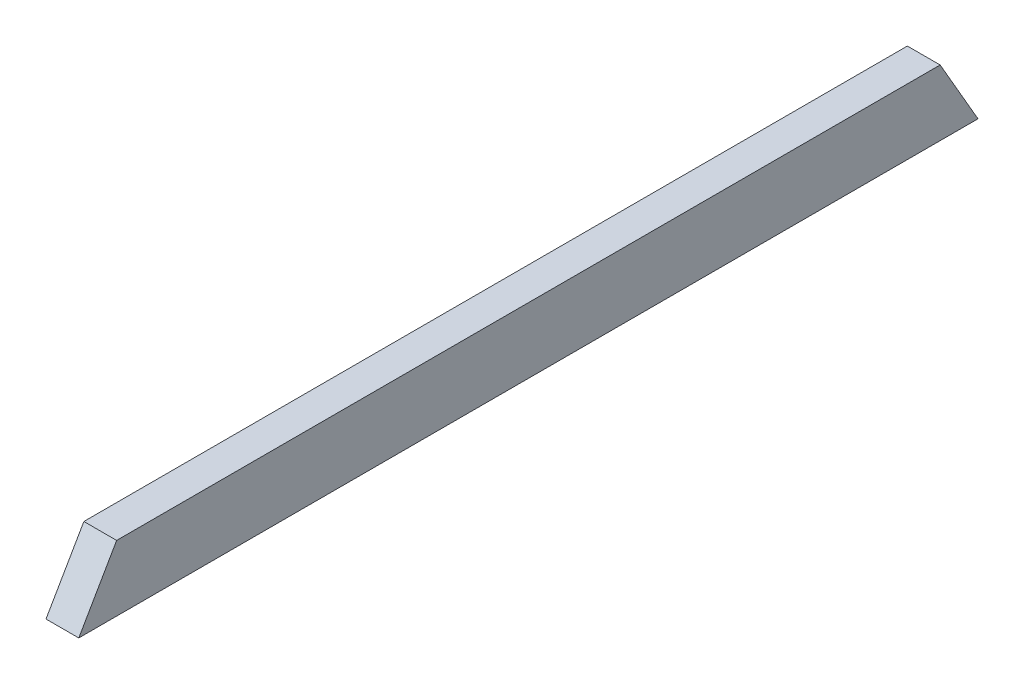
ISO-10303-21;
HEADER;
FILE_DESCRIPTION(('STEP AP214'),'2;1');
FILE_NAME('part.step','',(''),(''),'','','');
FILE_SCHEMA(('AUTOMOTIVE_DESIGN { 1 0 10303 214 1 1 1 1 }'));
ENDSEC;
DATA;
#1=APPLICATION_CONTEXT('core data for automotive mechanical design processes');
#2=APPLICATION_PROTOCOL_DEFINITION('international standard','automotive_design',2000,#1);
#3=PRODUCT_CONTEXT('',#1,'mechanical');
#4=PRODUCT('Part','Part','',(#3));
#5=PRODUCT_RELATED_PRODUCT_CATEGORY('part','',(#4));
#6=PRODUCT_DEFINITION_FORMATION('','',#4);
#7=PRODUCT_DEFINITION_CONTEXT('part definition',#1,'design');
#8=PRODUCT_DEFINITION('design','',#6,#7);
#9=PRODUCT_DEFINITION_SHAPE('','',#8);
#10=(LENGTH_UNIT() NAMED_UNIT(*) SI_UNIT(.MILLI.,.METRE.));
#11=(NAMED_UNIT(*) PLANE_ANGLE_UNIT() SI_UNIT($,.RADIAN.));
#12=(NAMED_UNIT(*) SI_UNIT($,.STERADIAN.) SOLID_ANGLE_UNIT());
#13=UNCERTAINTY_MEASURE_WITH_UNIT(LENGTH_MEASURE(1.E-05),#10,'distance_accuracy_value','');
#14=(GEOMETRIC_REPRESENTATION_CONTEXT(3) GLOBAL_UNCERTAINTY_ASSIGNED_CONTEXT((#13)) GLOBAL_UNIT_ASSIGNED_CONTEXT((#10,
#11,#12)) REPRESENTATION_CONTEXT('',''));
#15=CARTESIAN_POINT('',(0.,0.,0.));
#16=DIRECTION('',(0.,0.,1.));
#17=DIRECTION('',(1.,0.,0.));
#18=AXIS2_PLACEMENT_3D('',#15,#16,#17);
#19=CARTESIAN_POINT('',(0.,0.,1219.2));
#20=DIRECTION('',(-1.,0.,0.));
#21=DIRECTION('',(0.,0.,1.));
#22=AXIS2_PLACEMENT_3D('',#19,#20,#21);
#23=PLANE('',#22);
#24=DIRECTION('',(0.,0.,-1.));
#25=VECTOR('',#24,1.);
#26=CARTESIAN_POINT('',(0.,88.9,1219.2));
#27=LINE('',#26,#25);
#28=CARTESIAN_POINT('',(0.,88.9,1167.87356106904));
#29=VERTEX_POINT('',#28);
#30=CARTESIAN_POINT('',(0.,88.9,51.3264389309573));
#31=VERTEX_POINT('',#30);
#32=EDGE_CURVE('E11',#29,#31,#27,.T.);
#33=ORIENTED_EDGE('',*,*,#32,.F.);
#34=DIRECTION('',(0.,0.866025403784442,-0.499999999999994));
#35=VECTOR('',#34,1.);
#36=CARTESIAN_POINT('',(0.,0.,1219.2));
#37=LINE('',#36,#35);
#38=CARTESIAN_POINT('',(0.,0.,1219.2));
#39=VERTEX_POINT('',#38);
#40=EDGE_CURVE('E69',#39,#29,#37,.T.);
#41=ORIENTED_EDGE('',*,*,#40,.F.);
#42=DIRECTION('',(0.,0.,-1.));
#43=VECTOR('',#42,1.);
#44=CARTESIAN_POINT('',(0.,0.,1219.2));
#45=LINE('',#44,#43);
#46=CARTESIAN_POINT('',(0.,0.,0.));
#47=VERTEX_POINT('',#46);
#48=EDGE_CURVE('E74',#39,#47,#45,.T.);
#49=ORIENTED_EDGE('',*,*,#48,.T.);
#50=DIRECTION('',(0.,-0.86602540378444,-0.499999999999997));
#51=VECTOR('',#50,1.);
#52=CARTESIAN_POINT('',(0.,0.,0.));
#53=LINE('',#52,#51);
#54=EDGE_CURVE('E100',#31,#47,#53,.T.);
#55=ORIENTED_EDGE('',*,*,#54,.F.);
#56=EDGE_LOOP('',(#33,#41,#49,#55));
#57=FACE_BOUND('',#56,.T.);
#58=ADVANCED_FACE('F32',(#57),#23,.F.);
#59=CARTESIAN_POINT('',(0.,88.9,1219.2));
#60=DIRECTION('',(0.,-1.,0.));
#61=DIRECTION('',(0.,0.,-1.));
#62=AXIS2_PLACEMENT_3D('',#59,#60,#61);
#63=PLANE('',#62);
#64=DIRECTION('',(0.,0.,-1.));
#65=VECTOR('',#64,1.);
#66=CARTESIAN_POINT('',(-44.45,88.9,1219.2));
#67=LINE('',#66,#65);
#68=CARTESIAN_POINT('',(-44.45,88.9,1167.87356106904));
#69=VERTEX_POINT('',#68);
#70=CARTESIAN_POINT('',(-44.45,88.9,51.3264389309573));
#71=VERTEX_POINT('',#70);
#72=EDGE_CURVE('E40',#69,#71,#67,.T.);
#73=ORIENTED_EDGE('',*,*,#72,.F.);
#74=DIRECTION('',(1.,0.,0.));
#75=VECTOR('',#74,1.);
#76=CARTESIAN_POINT('',(-88.9,88.9,1167.87356106904));
#77=LINE('',#76,#75);
#78=EDGE_CURVE('E81',#69,#29,#77,.T.);
#79=ORIENTED_EDGE('',*,*,#78,.T.);
#80=ORIENTED_EDGE('',*,*,#32,.T.);
#81=DIRECTION('',(1.,0.,0.));
#82=VECTOR('',#81,1.);
#83=CARTESIAN_POINT('',(-88.9,88.9,51.3264389309573));
#84=LINE('',#83,#82);
#85=EDGE_CURVE('E82',#71,#31,#84,.T.);
#86=ORIENTED_EDGE('',*,*,#85,.F.);
#87=EDGE_LOOP('',(#73,#79,#80,#86));
#88=FACE_BOUND('',#87,.T.);
#89=ADVANCED_FACE('F98',(#88),#63,.F.);
#90=CARTESIAN_POINT('',(-44.45,0.,1219.2));
#91=DIRECTION('',(1.,0.,0.));
#92=DIRECTION('',(0.,0.,-1.));
#93=AXIS2_PLACEMENT_3D('',#90,#91,#92);
#94=PLANE('',#93);
#95=DIRECTION('',(0.,0.,-1.));
#96=VECTOR('',#95,1.);
#97=CARTESIAN_POINT('',(-44.45,0.,1219.2));
#98=LINE('',#97,#96);
#99=CARTESIAN_POINT('',(-44.45,0.,1219.2));
#100=VERTEX_POINT('',#99);
#101=CARTESIAN_POINT('',(-44.45,0.,0.));
#102=VERTEX_POINT('',#101);
#103=EDGE_CURVE('E86',#100,#102,#98,.T.);
#104=ORIENTED_EDGE('',*,*,#103,.F.);
#105=DIRECTION('',(0.,0.866025403784442,-0.499999999999994));
#106=VECTOR('',#105,1.);
#107=CARTESIAN_POINT('',(-44.45,0.,1219.2));
#108=LINE('',#107,#106);
#109=EDGE_CURVE('E46',#100,#69,#108,.T.);
#110=ORIENTED_EDGE('',*,*,#109,.T.);
#111=ORIENTED_EDGE('',*,*,#72,.T.);
#112=DIRECTION('',(0.,-0.86602540378444,-0.499999999999997));
#113=VECTOR('',#112,1.);
#114=CARTESIAN_POINT('',(-44.45,527.929086146992,304.799999999997));
#115=LINE('',#114,#113);
#116=EDGE_CURVE('E95',#71,#102,#115,.T.);
#117=ORIENTED_EDGE('',*,*,#116,.T.);
#118=EDGE_LOOP('',(#104,#110,#111,#117));
#119=FACE_BOUND('',#118,.T.);
#120=ADVANCED_FACE('F94',(#119),#94,.F.);
#121=CARTESIAN_POINT('',(0.,0.,1219.2));
#122=DIRECTION('',(0.,1.,0.));
#123=DIRECTION('',(-1.,0.,0.));
#124=AXIS2_PLACEMENT_3D('',#121,#122,#123);
#125=PLANE('',#124);
#126=DIRECTION('',(1.,0.,0.));
#127=VECTOR('',#126,1.);
#128=CARTESIAN_POINT('',(0.,0.,0.));
#129=LINE('',#128,#127);
#130=EDGE_CURVE('E75',#102,#47,#129,.T.);
#131=ORIENTED_EDGE('',*,*,#130,.T.);
#132=ORIENTED_EDGE('',*,*,#48,.F.);
#133=DIRECTION('',(1.,0.,0.));
#134=VECTOR('',#133,1.);
#135=CARTESIAN_POINT('',(0.,0.,1219.2));
#136=LINE('',#135,#134);
#137=EDGE_CURVE('E66',#100,#39,#136,.T.);
#138=ORIENTED_EDGE('',*,*,#137,.F.);
#139=ORIENTED_EDGE('',*,*,#103,.T.);
#140=EDGE_LOOP('',(#131,#132,#138,#139));
#141=FACE_BOUND('',#140,.T.);
#142=ADVANCED_FACE('F85',(#141),#125,.F.);
#143=CARTESIAN_POINT('',(-88.9,0.,0.));
#144=DIRECTION('',(0.,-0.499999999999997,0.86602540378444));
#145=DIRECTION('',(0.,-0.86602540378444,-0.499999999999997));
#146=AXIS2_PLACEMENT_3D('',#143,#144,#145);
#147=PLANE('',#146);
#148=ORIENTED_EDGE('',*,*,#85,.T.);
#149=ORIENTED_EDGE('',*,*,#54,.T.);
#150=ORIENTED_EDGE('',*,*,#130,.F.);
#151=ORIENTED_EDGE('',*,*,#116,.F.);
#152=EDGE_LOOP('',(#148,#149,#150,#151));
#153=FACE_BOUND('',#152,.T.);
#154=ADVANCED_FACE('F106',(#153),#147,.F.);
#155=CARTESIAN_POINT('',(-88.9,0.,1219.2));
#156=DIRECTION('',(0.,-0.499999999999994,-0.866025403784442));
#157=DIRECTION('',(0.,0.866025403784442,-0.499999999999994));
#158=AXIS2_PLACEMENT_3D('',#155,#156,#157);
#159=PLANE('',#158);
#160=ORIENTED_EDGE('',*,*,#137,.T.);
#161=ORIENTED_EDGE('',*,*,#40,.T.);
#162=ORIENTED_EDGE('',*,*,#78,.F.);
#163=ORIENTED_EDGE('',*,*,#109,.F.);
#164=EDGE_LOOP('',(#160,#161,#162,#163));
#165=FACE_BOUND('',#164,.T.);
#166=ADVANCED_FACE('F68',(#165),#159,.F.);
#167=CLOSED_SHELL('',(#58,#89,#120,#142,#154,#166));
#168=MANIFOLD_SOLID_BREP('B2',#167);
#169=ADVANCED_BREP_SHAPE_REPRESENTATION('',(#18,#168),#14);
#170=SHAPE_DEFINITION_REPRESENTATION(#9,#169);
ENDSEC;
END-ISO-10303-21;
